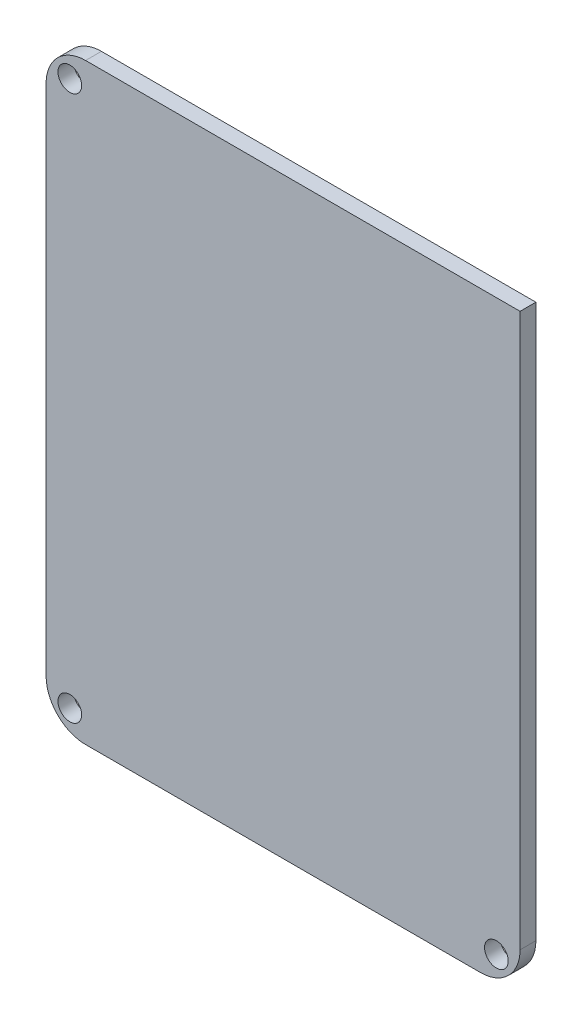
ISO-10303-21;
HEADER;
FILE_DESCRIPTION(('STEP AP214'),'2;1');
FILE_NAME('part.step','',(''),(''),'','','');
FILE_SCHEMA(('AUTOMOTIVE_DESIGN { 1 0 10303 214 1 1 1 1 }'));
ENDSEC;
DATA;
#1=APPLICATION_CONTEXT('core data for automotive mechanical design processes');
#2=APPLICATION_PROTOCOL_DEFINITION('international standard','automotive_design',2000,#1);
#3=PRODUCT_CONTEXT('',#1,'mechanical');
#4=PRODUCT('Part','Part','',(#3));
#5=PRODUCT_RELATED_PRODUCT_CATEGORY('part','',(#4));
#6=PRODUCT_DEFINITION_FORMATION('','',#4);
#7=PRODUCT_DEFINITION_CONTEXT('part definition',#1,'design');
#8=PRODUCT_DEFINITION('design','',#6,#7);
#9=PRODUCT_DEFINITION_SHAPE('','',#8);
#10=(LENGTH_UNIT() NAMED_UNIT(*) SI_UNIT(.MILLI.,.METRE.));
#11=(NAMED_UNIT(*) PLANE_ANGLE_UNIT() SI_UNIT($,.RADIAN.));
#12=(NAMED_UNIT(*) SI_UNIT($,.STERADIAN.) SOLID_ANGLE_UNIT());
#13=UNCERTAINTY_MEASURE_WITH_UNIT(LENGTH_MEASURE(1.E-05),#10,'distance_accuracy_value','');
#14=(GEOMETRIC_REPRESENTATION_CONTEXT(3) GLOBAL_UNCERTAINTY_ASSIGNED_CONTEXT((#13)) GLOBAL_UNIT_ASSIGNED_CONTEXT((#10,
#11,#12)) REPRESENTATION_CONTEXT('',''));
#15=CARTESIAN_POINT('',(0.,0.,0.));
#16=DIRECTION('',(0.,0.,1.));
#17=DIRECTION('',(1.,0.,0.));
#18=AXIS2_PLACEMENT_3D('',#15,#16,#17);
#19=CARTESIAN_POINT('',(-53.9067346155954,69.7984729756882,2.));
#20=DIRECTION('',(1.,0.,0.));
#21=DIRECTION('',(0.,0.,-1.));
#22=AXIS2_PLACEMENT_3D('',#19,#20,#21);
#23=PLANE('',#22);
#24=DIRECTION('',(0.,-1.,0.));
#25=VECTOR('',#24,1.);
#26=CARTESIAN_POINT('',(-53.9067346155954,69.7984729756882,0.));
#27=LINE('',#26,#25);
#28=CARTESIAN_POINT('',(-53.9067346155954,64.7984729756882,0.));
#29=VERTEX_POINT('',#28);
#30=CARTESIAN_POINT('',(-53.9067346155954,-0.201527024311823,0.));
#31=VERTEX_POINT('',#30);
#32=EDGE_CURVE('E129',#29,#31,#27,.T.);
#33=ORIENTED_EDGE('',*,*,#32,.T.);
#34=CARTESIAN_POINT('',(-53.9067346155954,-0.201527024311829,6.));
#35=CARTESIAN_POINT('',(-53.9067346155954,-0.201527024311829,4.66666666666667));
#36=CARTESIAN_POINT('',(-53.9067346155954,-0.201527024311829,3.33333333333333));
#37=CARTESIAN_POINT('',(-53.9067346155954,-0.201527024311829,2.));
#38=CARTESIAN_POINT('',(-53.9067346155954,-0.201527024311829,1.33333333333333));
#39=CARTESIAN_POINT('',(-53.9067346155954,-0.201527024311829,0.666666666666667));
#40=CARTESIAN_POINT('',(-53.9067346155954,-0.201527024311829,0.));
#41=CARTESIAN_POINT('',(-53.9067346155954,-0.201527024311829,-1.33333333333333));
#42=CARTESIAN_POINT('',(-53.9067346155954,-0.201527024311829,-2.66666666666667));
#43=CARTESIAN_POINT('',(-53.9067346155954,-0.201527024311829,-4.));
#44=(BOUNDED_CURVE() B_SPLINE_CURVE(3,(#34,#35,#36,#37,#38,#39,#40,#41,#42,#43),.UNSPECIFIED.,
.F.,.F.) B_SPLINE_CURVE_WITH_KNOTS((4,3,3,4),(-0.004,0.,0.002,0.006),
.UNSPECIFIED.) CURVE() GEOMETRIC_REPRESENTATION_ITEM() RATIONAL_B_SPLINE_CURVE((1.,1.,1.,1.,1.,
1.,1.,1.,1.,1.)) REPRESENTATION_ITEM(''));
#45=CARTESIAN_POINT('',(-53.9067346155954,-0.201527024311823,2.));
#46=VERTEX_POINT('',#45);
#47=EDGE_CURVE('E53',#31,#46,#44,.F.);
#48=ORIENTED_EDGE('',*,*,#47,.T.);
#49=DIRECTION('',(0.,-1.,0.));
#50=VECTOR('',#49,1.);
#51=CARTESIAN_POINT('',(-53.9067346155954,69.7984729756882,2.));
#52=LINE('',#51,#50);
#53=CARTESIAN_POINT('',(-53.9067346155954,64.7984729756882,2.));
#54=VERTEX_POINT('',#53);
#55=EDGE_CURVE('E137',#54,#46,#52,.T.);
#56=ORIENTED_EDGE('',*,*,#55,.F.);
#57=CARTESIAN_POINT('',(-53.9067346155954,64.7984729756882,6.));
#58=CARTESIAN_POINT('',(-53.9067346155954,64.7984729756882,4.66666666666667));
#59=CARTESIAN_POINT('',(-53.9067346155954,64.7984729756882,3.33333333333333));
#60=CARTESIAN_POINT('',(-53.9067346155954,64.7984729756882,2.));
#61=CARTESIAN_POINT('',(-53.9067346155954,64.7984729756882,1.33333333333333));
#62=CARTESIAN_POINT('',(-53.9067346155954,64.7984729756882,0.666666666666667));
#63=CARTESIAN_POINT('',(-53.9067346155954,64.7984729756882,0.));
#64=CARTESIAN_POINT('',(-53.9067346155954,64.7984729756882,-1.33333333333333));
#65=CARTESIAN_POINT('',(-53.9067346155954,64.7984729756882,-2.66666666666667));
#66=CARTESIAN_POINT('',(-53.9067346155954,64.7984729756882,-4.));
#67=(BOUNDED_CURVE() B_SPLINE_CURVE(3,(#57,#58,#59,#60,#61,#62,#63,#64,#65,#66),.UNSPECIFIED.,
.F.,.F.) B_SPLINE_CURVE_WITH_KNOTS((4,3,3,4),(-0.004,0.,0.002,0.006),
.UNSPECIFIED.) CURVE() GEOMETRIC_REPRESENTATION_ITEM() RATIONAL_B_SPLINE_CURVE((1.,1.,1.,1.,1.,
1.,1.,1.,1.,1.)) REPRESENTATION_ITEM(''));
#68=EDGE_CURVE('E211',#54,#29,#67,.T.);
#69=ORIENTED_EDGE('',*,*,#68,.T.);
#70=EDGE_LOOP('',(#33,#48,#56,#69));
#71=FACE_BOUND('',#70,.T.);
#72=ADVANCED_FACE('F39',(#71),#23,.F.);
#73=CARTESIAN_POINT('',(-53.9067346155954,-5.20152702431183,2.));
#74=DIRECTION('',(0.,1.,0.));
#75=DIRECTION('',(0.,0.,1.));
#76=AXIS2_PLACEMENT_3D('',#73,#74,#75);
#77=PLANE('',#76);
#78=DIRECTION('',(1.,0.,0.));
#79=VECTOR('',#78,1.);
#80=CARTESIAN_POINT('',(-53.9067346155954,-5.20152702431183,0.));
#81=LINE('',#80,#79);
#82=CARTESIAN_POINT('',(-48.9067346155954,-5.20152702431183,0.));
#83=VERTEX_POINT('',#82);
#84=CARTESIAN_POINT('',(1.0932653844046,-5.20152702431183,0.));
#85=VERTEX_POINT('',#84);
#86=EDGE_CURVE('E131',#83,#85,#81,.T.);
#87=ORIENTED_EDGE('',*,*,#86,.T.);
#88=CARTESIAN_POINT('',(1.0932653844046,-5.20152702431183,6.));
#89=CARTESIAN_POINT('',(1.0932653844046,-5.20152702431183,4.66666666666667));
#90=CARTESIAN_POINT('',(1.0932653844046,-5.20152702431183,3.33333333333333));
#91=CARTESIAN_POINT('',(1.0932653844046,-5.20152702431183,2.));
#92=CARTESIAN_POINT('',(1.0932653844046,-5.20152702431183,1.33333333333333));
#93=CARTESIAN_POINT('',(1.0932653844046,-5.20152702431183,0.666666666666667));
#94=CARTESIAN_POINT('',(1.0932653844046,-5.20152702431183,0.));
#95=CARTESIAN_POINT('',(1.0932653844046,-5.20152702431183,-1.33333333333333));
#96=CARTESIAN_POINT('',(1.0932653844046,-5.20152702431183,-2.66666666666667));
#97=CARTESIAN_POINT('',(1.0932653844046,-5.20152702431183,-4.));
#98=(BOUNDED_CURVE() B_SPLINE_CURVE(3,(#88,#89,#90,#91,#92,#93,#94,#95,#96,#97),.UNSPECIFIED.,
.F.,.F.) B_SPLINE_CURVE_WITH_KNOTS((4,3,3,4),(-0.004,0.,0.002,0.006),
.UNSPECIFIED.) CURVE() GEOMETRIC_REPRESENTATION_ITEM() RATIONAL_B_SPLINE_CURVE((1.,1.,1.,1.,1.,
1.,1.,1.,1.,1.)) REPRESENTATION_ITEM(''));
#99=CARTESIAN_POINT('',(1.0932653844046,-5.20152702431183,2.));
#100=VERTEX_POINT('',#99);
#101=EDGE_CURVE('E242',#85,#100,#98,.F.);
#102=ORIENTED_EDGE('',*,*,#101,.T.);
#103=DIRECTION('',(1.,0.,0.));
#104=VECTOR('',#103,1.);
#105=CARTESIAN_POINT('',(-53.9067346155954,-5.20152702431183,2.));
#106=LINE('',#105,#104);
#107=CARTESIAN_POINT('',(-48.9067346155954,-5.20152702431183,2.));
#108=VERTEX_POINT('',#107);
#109=EDGE_CURVE('E115',#108,#100,#106,.T.);
#110=ORIENTED_EDGE('',*,*,#109,.F.);
#111=CARTESIAN_POINT('',(-48.9067346155954,-5.20152702431183,6.));
#112=CARTESIAN_POINT('',(-48.9067346155954,-5.20152702431183,4.66666666666667));
#113=CARTESIAN_POINT('',(-48.9067346155954,-5.20152702431183,3.33333333333333));
#114=CARTESIAN_POINT('',(-48.9067346155954,-5.20152702431183,2.));
#115=CARTESIAN_POINT('',(-48.9067346155954,-5.20152702431183,1.33333333333333));
#116=CARTESIAN_POINT('',(-48.9067346155954,-5.20152702431183,0.666666666666667));
#117=CARTESIAN_POINT('',(-48.9067346155954,-5.20152702431183,0.));
#118=CARTESIAN_POINT('',(-48.9067346155954,-5.20152702431183,-1.33333333333333));
#119=CARTESIAN_POINT('',(-48.9067346155954,-5.20152702431183,-2.66666666666667));
#120=CARTESIAN_POINT('',(-48.9067346155954,-5.20152702431183,-4.));
#121=(BOUNDED_CURVE() B_SPLINE_CURVE(3,(#111,#112,#113,#114,#115,#116,#117,#118,#119,#120),
.UNSPECIFIED.,.F.,.F.) B_SPLINE_CURVE_WITH_KNOTS((4,3,3,4),(-0.004,0.,0.002,0.006),
.UNSPECIFIED.) CURVE() GEOMETRIC_REPRESENTATION_ITEM() RATIONAL_B_SPLINE_CURVE((1.,1.,1.,1.,1.,
1.,1.,1.,1.,1.)) REPRESENTATION_ITEM(''));
#122=EDGE_CURVE('E177',#108,#83,#121,.T.);
#123=ORIENTED_EDGE('',*,*,#122,.T.);
#124=EDGE_LOOP('',(#87,#102,#110,#123));
#125=FACE_BOUND('',#124,.T.);
#126=ADVANCED_FACE('F240',(#125),#77,.F.);
#127=CARTESIAN_POINT('',(6.0932653844046,69.7984729756882,2.));
#128=DIRECTION('',(-1.,0.,0.));
#129=DIRECTION('',(0.,-1.,0.));
#130=AXIS2_PLACEMENT_3D('',#127,#128,#129);
#131=PLANE('',#130);
#132=DIRECTION('',(0.,1.,0.));
#133=VECTOR('',#132,1.);
#134=CARTESIAN_POINT('',(6.0932653844046,69.7984729756882,2.));
#135=LINE('',#134,#133);
#136=CARTESIAN_POINT('',(6.0932653844046,-0.201527024311823,2.));
#137=VERTEX_POINT('',#136);
#138=CARTESIAN_POINT('',(6.0932653844046,69.7984729756882,2.));
#139=VERTEX_POINT('',#138);
#140=EDGE_CURVE('E104',#137,#139,#135,.T.);
#141=ORIENTED_EDGE('',*,*,#140,.F.);
#142=CARTESIAN_POINT('',(6.0932653844046,-0.201527024311827,6.));
#143=CARTESIAN_POINT('',(6.0932653844046,-0.201527024311827,4.66666666666667));
#144=CARTESIAN_POINT('',(6.0932653844046,-0.201527024311827,3.33333333333333));
#145=CARTESIAN_POINT('',(6.0932653844046,-0.201527024311827,2.));
#146=CARTESIAN_POINT('',(6.0932653844046,-0.201527024311827,1.33333333333333));
#147=CARTESIAN_POINT('',(6.0932653844046,-0.201527024311827,0.666666666666667));
#148=CARTESIAN_POINT('',(6.0932653844046,-0.201527024311827,0.));
#149=CARTESIAN_POINT('',(6.0932653844046,-0.201527024311827,-1.33333333333333));
#150=CARTESIAN_POINT('',(6.0932653844046,-0.201527024311827,-2.66666666666667));
#151=CARTESIAN_POINT('',(6.0932653844046,-0.201527024311827,-4.));
#152=(BOUNDED_CURVE() B_SPLINE_CURVE(3,(#142,#143,#144,#145,#146,#147,#148,#149,#150,#151),
.UNSPECIFIED.,.F.,.F.) B_SPLINE_CURVE_WITH_KNOTS((4,3,3,4),(-0.004,0.,0.002,0.006),
.UNSPECIFIED.) CURVE() GEOMETRIC_REPRESENTATION_ITEM() RATIONAL_B_SPLINE_CURVE((1.,1.,1.,1.,1.,
1.,1.,1.,1.,1.)) REPRESENTATION_ITEM(''));
#153=CARTESIAN_POINT('',(6.0932653844046,-0.201527024311823,0.));
#154=VERTEX_POINT('',#153);
#155=EDGE_CURVE('E123',#137,#154,#152,.T.);
#156=ORIENTED_EDGE('',*,*,#155,.T.);
#157=DIRECTION('',(0.,1.,0.));
#158=VECTOR('',#157,1.);
#159=CARTESIAN_POINT('',(6.0932653844046,69.7984729756882,0.));
#160=LINE('',#159,#158);
#161=CARTESIAN_POINT('',(6.0932653844046,69.7984729756882,0.));
#162=VERTEX_POINT('',#161);
#163=EDGE_CURVE('E121',#154,#162,#160,.T.);
#164=ORIENTED_EDGE('',*,*,#163,.T.);
#165=DIRECTION('',(0.,0.,-1.));
#166=VECTOR('',#165,1.);
#167=CARTESIAN_POINT('',(6.0932653844046,69.7984729756882,2.));
#168=LINE('',#167,#166);
#169=EDGE_CURVE('E118',#139,#162,#168,.T.);
#170=ORIENTED_EDGE('',*,*,#169,.F.);
#171=EDGE_LOOP('',(#141,#156,#164,#170));
#172=FACE_BOUND('',#171,.T.);
#173=ADVANCED_FACE('F119',(#172),#131,.F.);
#174=CARTESIAN_POINT('',(-53.9067346155954,69.7984729756882,2.));
#175=DIRECTION('',(0.,-1.,0.));
#176=DIRECTION('',(0.,0.,-1.));
#177=AXIS2_PLACEMENT_3D('',#174,#175,#176);
#178=PLANE('',#177);
#179=DIRECTION('',(-1.,0.,0.));
#180=VECTOR('',#179,1.);
#181=CARTESIAN_POINT('',(-53.9067346155954,69.7984729756882,0.));
#182=LINE('',#181,#180);
#183=CARTESIAN_POINT('',(-48.9067346155954,69.7984729756882,0.));
#184=VERTEX_POINT('',#183);
#185=EDGE_CURVE('E136',#162,#184,#182,.T.);
#186=ORIENTED_EDGE('',*,*,#185,.T.);
#187=CARTESIAN_POINT('',(-48.9067346155954,69.7984729756882,6.));
#188=CARTESIAN_POINT('',(-48.9067346155954,69.7984729756882,4.66666666666667));
#189=CARTESIAN_POINT('',(-48.9067346155954,69.7984729756882,3.33333333333333));
#190=CARTESIAN_POINT('',(-48.9067346155954,69.7984729756882,2.));
#191=CARTESIAN_POINT('',(-48.9067346155954,69.7984729756882,1.33333333333333));
#192=CARTESIAN_POINT('',(-48.9067346155954,69.7984729756882,0.666666666666667));
#193=CARTESIAN_POINT('',(-48.9067346155954,69.7984729756882,0.));
#194=CARTESIAN_POINT('',(-48.9067346155954,69.7984729756882,-1.33333333333333));
#195=CARTESIAN_POINT('',(-48.9067346155954,69.7984729756882,-2.66666666666667));
#196=CARTESIAN_POINT('',(-48.9067346155954,69.7984729756882,-4.));
#197=(BOUNDED_CURVE() B_SPLINE_CURVE(3,(#187,#188,#189,#190,#191,#192,#193,#194,#195,#196),
.UNSPECIFIED.,.F.,.F.) B_SPLINE_CURVE_WITH_KNOTS((4,3,3,4),(-0.004,0.,0.002,0.006),
.UNSPECIFIED.) CURVE() GEOMETRIC_REPRESENTATION_ITEM() RATIONAL_B_SPLINE_CURVE((1.,1.,1.,1.,1.,
1.,1.,1.,1.,1.)) REPRESENTATION_ITEM(''));
#198=CARTESIAN_POINT('',(-48.9067346155954,69.7984729756882,2.));
#199=VERTEX_POINT('',#198);
#200=EDGE_CURVE('E12',#184,#199,#197,.F.);
#201=ORIENTED_EDGE('',*,*,#200,.T.);
#202=DIRECTION('',(-1.,0.,0.));
#203=VECTOR('',#202,1.);
#204=CARTESIAN_POINT('',(-53.9067346155954,69.7984729756882,2.));
#205=LINE('',#204,#203);
#206=EDGE_CURVE('E108',#139,#199,#205,.T.);
#207=ORIENTED_EDGE('',*,*,#206,.F.);
#208=ORIENTED_EDGE('',*,*,#169,.T.);
#209=EDGE_LOOP('',(#186,#201,#207,#208));
#210=FACE_BOUND('',#209,.T.);
#211=ADVANCED_FACE('F125',(#210),#178,.F.);
#212=CARTESIAN_POINT('',(0.,0.,2.));
#213=DIRECTION('',(0.,0.,1.));
#214=DIRECTION('',(1.,0.,0.));
#215=AXIS2_PLACEMENT_3D('',#212,#213,#214);
#216=PLANE('',#215);
#217=CARTESIAN_POINT('',(-50.9067346155954,66.7984729756882,2.));
#218=DIRECTION('',(0.,0.,1.));
#219=DIRECTION('',(1.,0.,0.));
#220=AXIS2_PLACEMENT_3D('',#217,#218,#219);
#221=CIRCLE('',#220,1.5);
#222=CARTESIAN_POINT('',(-49.4067346155954,66.7984729756882,2.));
#223=VERTEX_POINT('',#222);
#224=EDGE_CURVE('E267',#223,#223,#221,.T.);
#225=ORIENTED_EDGE('',*,*,#224,.F.);
#226=EDGE_LOOP('',(#225));
#227=FACE_BOUND('',#226,.T.);
#228=CARTESIAN_POINT('',(3.09326538440461,-2.20152702431183,2.));
#229=DIRECTION('',(0.,0.,1.));
#230=DIRECTION('',(1.,0.,0.));
#231=AXIS2_PLACEMENT_3D('',#228,#229,#230);
#232=CIRCLE('',#231,1.5);
#233=CARTESIAN_POINT('',(4.59326538440461,-2.20152702431183,2.));
#234=VERTEX_POINT('',#233);
#235=EDGE_CURVE('E261',#234,#234,#232,.T.);
#236=ORIENTED_EDGE('',*,*,#235,.F.);
#237=EDGE_LOOP('',(#236));
#238=FACE_BOUND('',#237,.T.);
#239=CARTESIAN_POINT('',(-50.9067346155954,-2.20152702431183,2.));
#240=DIRECTION('',(0.,0.,1.));
#241=DIRECTION('',(1.,0.,0.));
#242=AXIS2_PLACEMENT_3D('',#239,#240,#241);
#243=CIRCLE('',#242,1.5);
#244=CARTESIAN_POINT('',(-49.4067346155954,-2.20152702431183,2.));
#245=VERTEX_POINT('',#244);
#246=EDGE_CURVE('E255',#245,#245,#243,.T.);
#247=ORIENTED_EDGE('',*,*,#246,.F.);
#248=EDGE_LOOP('',(#247));
#249=FACE_BOUND('',#248,.T.);
#250=ORIENTED_EDGE('',*,*,#109,.T.);
#251=CARTESIAN_POINT('',(1.0932653844046,-5.20152702431183,2.));
#252=CARTESIAN_POINT('',(1.23389567922772,-5.2015421466558,2.));
#253=CARTESIAN_POINT('',(1.37452380353334,-5.19559459515653,2.));
#254=CARTESIAN_POINT('',(1.6547738908614,-5.17188336622226,2.));
#255=CARTESIAN_POINT('',(1.79439590182419,-5.15412025560138,2.));
#256=CARTESIAN_POINT('',(2.07154087736499,-5.10690495585043,2.));
#257=CARTESIAN_POINT('',(2.20906534830119,-5.07746160933643,2.));
#258=CARTESIAN_POINT('',(2.48114490326872,-5.00710002063408,2.));
#259=CARTESIAN_POINT('',(2.61570002352584,-4.96618191852025,2.));
#260=CARTESIAN_POINT('',(2.88092678031722,-4.87314598375576,2.));
#261=CARTESIAN_POINT('',(3.0115972293086,-4.8210247655881,2.));
#262=CARTESIAN_POINT('',(3.26813080676646,-4.7059394170615,2.));
#263=CARTESIAN_POINT('',(3.39399214041668,-4.64297128588459,2.));
#264=CARTESIAN_POINT('',(3.63989399894763,-4.50669044328173,2.));
#265=CARTESIAN_POINT('',(3.75993765973417,-4.43338339009385,2.));
#266=CARTESIAN_POINT('',(3.99346769345669,-4.27689085330054,2.));
#267=CARTESIAN_POINT('',(4.10695163493643,-4.1937017412299,2.));
#268=CARTESIAN_POINT('',(4.32646553685194,-4.01809165962601,2.));
#269=CARTESIAN_POINT('',(4.43249831382802,-3.92567421073416,2.));
#270=CARTESIAN_POINT('',(4.63644195349461,-3.73220164807186,2.));
#271=CARTESIAN_POINT('',(4.73434977587649,-3.63114332940368,2.));
#272=CARTESIAN_POINT('',(4.92128744986757,-3.42115494210269,2.));
#273=CARTESIAN_POINT('',(5.01031879048617,-3.31222619902073,2.));
#274=CARTESIAN_POINT('',(5.17891936735852,-3.0872163000013,2.));
#275=CARTESIAN_POINT('',(5.25848522746781,-2.97113261431968,2.));
#276=CARTESIAN_POINT('',(5.40755331897001,-2.73267117836143,2.));
#277=CARTESIAN_POINT('',(5.47705538883348,-2.61029332710264,2.));
#278=CARTESIAN_POINT('',(5.60550012374205,-2.36011704201003,2.));
#279=CARTESIAN_POINT('',(5.66444274368383,-2.23231858502567,2.));
#280=CARTESIAN_POINT('',(5.77132372159595,-1.97226660778079,2.));
#281=CARTESIAN_POINT('',(5.81926735855736,-1.84001525979685,2.));
#282=CARTESIAN_POINT('',(5.90383472227703,-1.57199335910877,2.));
#283=CARTESIAN_POINT('',(5.94046091397629,-1.43622357971146,2.));
#284=CARTESIAN_POINT('',(6.01181664546114,-1.11906381565993,2.));
#285=CARTESIAN_POINT('',(6.04235891209967,-0.936704487992194,2.));
#286=CARTESIAN_POINT('',(6.07289919849986,-0.661701478659334,2.));
#287=CARTESIAN_POINT('',(6.08053376828899,-0.569836516089367,2.));
#288=CARTESIAN_POINT('',(6.09071624828025,-0.385830909417624,2.));
#289=CARTESIAN_POINT('',(6.09326448038056,-0.293690283131373,2.));
#290=CARTESIAN_POINT('',(6.0932653844046,-0.201527024311827,2.));
#291=B_SPLINE_CURVE_WITH_KNOTS('',3,(#251,#252,#253,#254,#255,#256,#257,#258,#259,#260,#261,
#262,#263,#264,#265,#266,#267,#268,#269,#270,#271,#272,#273,#274,#275,#276,#277,#278,#279,#280,
#281,#282,#283,#284,#285,#286,#287,#288,#289,#290),.UNSPECIFIED.,.F.,.F.,(4,2,2,2,2,2,2,2,2,2,2,
2,2,2,2,2,2,2,2,4),(0.,0.421762112767109,0.843503994288121,1.26492720019775,1.68634526193831,
2.10789085327979,2.52959226338523,2.95106377581048,3.37269052404618,3.79415703039214,
4.2157805424089,4.63733320863161,5.05903578615264,5.48074513148484,5.90245627805085,
6.32396459780776,6.74538104818462,7.29879231271561,7.57521919595989,7.85162858446835),.UNSPECIFIED.);
#292=EDGE_CURVE('E111',#100,#137,#291,.T.);
#293=ORIENTED_EDGE('',*,*,#292,.T.);
#294=ORIENTED_EDGE('',*,*,#140,.T.);
#295=ORIENTED_EDGE('',*,*,#206,.T.);
#296=CARTESIAN_POINT('',(-48.9067346155954,69.7984729756882,2.));
#297=CARTESIAN_POINT('',(-49.0473649104185,69.7984880980321,2.));
#298=CARTESIAN_POINT('',(-49.1879930347241,69.7925405465329,2.));
#299=CARTESIAN_POINT('',(-49.4682431220522,69.7688293175986,2.));
#300=CARTESIAN_POINT('',(-49.607865133015,69.7510662069777,2.));
#301=CARTESIAN_POINT('',(-49.8850101085558,69.7038509072268,2.));
#302=CARTESIAN_POINT('',(-50.022534579492,69.6744075607128,2.));
#303=CARTESIAN_POINT('',(-50.2946141344595,69.6040459720104,2.));
#304=CARTESIAN_POINT('',(-50.4291692547166,69.5631278698966,2.));
#305=CARTESIAN_POINT('',(-50.694396011508,69.4700919351321,2.));
#306=CARTESIAN_POINT('',(-50.8250664604994,69.4179707169644,2.));
#307=CARTESIAN_POINT('',(-51.0816000379572,69.3028853684378,2.));
#308=CARTESIAN_POINT('',(-51.2074613716075,69.239917237261,2.));
#309=CARTESIAN_POINT('',(-51.4533632301384,69.1036363946581,2.));
#310=CARTESIAN_POINT('',(-51.5734068909249,69.0303293414702,2.));
#311=CARTESIAN_POINT('',(-51.8069369246475,68.8738368046769,2.));
#312=CARTESIAN_POINT('',(-51.9204208661272,68.7906476926063,2.));
#313=CARTESIAN_POINT('',(-52.1399347680427,68.6150376110024,2.));
#314=CARTESIAN_POINT('',(-52.2459675450188,68.5226201621105,2.));
#315=CARTESIAN_POINT('',(-52.4499111846854,68.3291475994482,2.));
#316=CARTESIAN_POINT('',(-52.5478190070673,68.2280892807801,2.));
#317=CARTESIAN_POINT('',(-52.7347566810583,68.0181008934791,2.));
#318=CARTESIAN_POINT('',(-52.8237880216769,67.9091721503971,2.));
#319=CARTESIAN_POINT('',(-52.9923885985493,67.6841622513777,2.));
#320=CARTESIAN_POINT('',(-53.0719544586586,67.5680785656961,2.));
#321=CARTESIAN_POINT('',(-53.2210225501608,67.3296171297378,2.));
#322=CARTESIAN_POINT('',(-53.2905246200243,67.207239278479,2.));
#323=CARTESIAN_POINT('',(-53.4189693549328,66.9570629933864,2.));
#324=CARTESIAN_POINT('',(-53.4779119748746,66.8292645364021,2.));
#325=CARTESIAN_POINT('',(-53.5847929527867,66.5692125591572,2.));
#326=CARTESIAN_POINT('',(-53.6327365897481,66.4369612111732,2.));
#327=CARTESIAN_POINT('',(-53.7173039534678,66.1689393104851,2.));
#328=CARTESIAN_POINT('',(-53.7539301451671,66.0331695310879,2.));
#329=CARTESIAN_POINT('',(-53.8252858766519,65.7160097670363,2.));
#330=CARTESIAN_POINT('',(-53.8558281432905,65.5336504393686,2.));
#331=CARTESIAN_POINT('',(-53.8863684296906,65.2586474300357,2.));
#332=CARTESIAN_POINT('',(-53.8940029994798,65.1667824674657,2.));
#333=CARTESIAN_POINT('',(-53.904185479471,64.982776860794,2.));
#334=CARTESIAN_POINT('',(-53.9067337115714,64.8906362345077,2.));
#335=CARTESIAN_POINT('',(-53.9067346155954,64.7984729756882,2.));
#336=B_SPLINE_CURVE_WITH_KNOTS('',3,(#296,#297,#298,#299,#300,#301,#302,#303,#304,#305,#306,
#307,#308,#309,#310,#311,#312,#313,#314,#315,#316,#317,#318,#319,#320,#321,#322,#323,#324,#325,
#326,#327,#328,#329,#330,#331,#332,#333,#334,#335),.UNSPECIFIED.,.F.,.F.,(4,2,2,2,2,2,2,2,2,2,2,
2,2,2,2,2,2,2,2,4),(0.,0.4217621127671,0.843503994288108,1.26492720019772,1.68634526193828,
2.10789085327976,2.5295922633852,2.95106377581044,3.37269052404615,3.79415703039211,
4.21578054240886,4.63733320863157,5.0590357861526,5.48074513148481,5.90245627805082,
6.32396459780772,6.74538104818458,7.2987923127156,7.57521919595987,7.85162858446835),.UNSPECIFIED.);
#337=EDGE_CURVE('E243',#199,#54,#336,.T.);
#338=ORIENTED_EDGE('',*,*,#337,.T.);
#339=ORIENTED_EDGE('',*,*,#55,.T.);
#340=CARTESIAN_POINT('',(-53.9067346155954,-0.201527024311829,2.));
#341=CARTESIAN_POINT('',(-53.9067497379394,-0.342157319134948,2.));
#342=CARTESIAN_POINT('',(-53.9008021864401,-0.482785443440568,2.));
#343=CARTESIAN_POINT('',(-53.8770909575058,-0.763035530768629,2.));
#344=CARTESIAN_POINT('',(-53.859327846885,-0.902657541731418,2.));
#345=CARTESIAN_POINT('',(-53.812112547134,-1.17980251727222,2.));
#346=CARTESIAN_POINT('',(-53.78266920062,-1.31732698820842,2.));
#347=CARTESIAN_POINT('',(-53.7123076119176,-1.58940654317594,2.));
#348=CARTESIAN_POINT('',(-53.6713895098038,-1.72396166343306,2.));
#349=CARTESIAN_POINT('',(-53.5783535750393,-1.98918842022444,2.));
#350=CARTESIAN_POINT('',(-53.5262323568717,-2.11985886921583,2.));
#351=CARTESIAN_POINT('',(-53.4111470083451,-2.37639244667369,2.));
#352=CARTESIAN_POINT('',(-53.3481788771681,-2.50225378032391,2.));
#353=CARTESIAN_POINT('',(-53.2118980345653,-2.74815563885486,2.));
#354=CARTESIAN_POINT('',(-53.1385909813774,-2.8681992996414,2.));
#355=CARTESIAN_POINT('',(-52.9820984445841,-3.10172933336393,2.));
#356=CARTESIAN_POINT('',(-52.8989093325135,-3.21521327484367,2.));
#357=CARTESIAN_POINT('',(-52.7232992509096,-3.43472717675917,2.));
#358=CARTESIAN_POINT('',(-52.6308818020177,-3.54075995373525,2.));
#359=CARTESIAN_POINT('',(-52.4374092393554,-3.74470359340184,2.));
#360=CARTESIAN_POINT('',(-52.3363509206872,-3.84261141578372,2.));
#361=CARTESIAN_POINT('',(-52.1263625333862,-4.0295490897748,2.));
#362=CARTESIAN_POINT('',(-52.0174337903043,-4.11858043039339,2.));
#363=CARTESIAN_POINT('',(-51.7924238912848,-4.28718100726574,2.));
#364=CARTESIAN_POINT('',(-51.6763402056032,-4.36674686737503,2.));
#365=CARTESIAN_POINT('',(-51.437878769645,-4.51581495887724,2.));
#366=CARTESIAN_POINT('',(-51.3155009183862,-4.58531702874071,2.));
#367=CARTESIAN_POINT('',(-51.0653246332936,-4.71376176364928,2.));
#368=CARTESIAN_POINT('',(-50.9375261763092,-4.77270438359106,2.));
#369=CARTESIAN_POINT('',(-50.6774741990643,-4.87958536150318,2.));
#370=CARTESIAN_POINT('',(-50.5452228510804,-4.92752899846459,2.));
#371=CARTESIAN_POINT('',(-50.2772009503923,-5.01209636218425,2.));
#372=CARTESIAN_POINT('',(-50.141431170995,-5.04872255388352,2.));
#373=CARTESIAN_POINT('',(-49.8242714069435,-5.12007828536836,2.));
#374=CARTESIAN_POINT('',(-49.6419120792758,-5.1506205520069,2.));
#375=CARTESIAN_POINT('',(-49.3669090699429,-5.18116083840708,2.));
#376=CARTESIAN_POINT('',(-49.2750441073729,-5.18879540819621,2.));
#377=CARTESIAN_POINT('',(-49.0910385007012,-5.19897788818747,2.));
#378=CARTESIAN_POINT('',(-48.9988978744149,-5.20152612028778,2.));
#379=CARTESIAN_POINT('',(-48.9067346155954,-5.20152702431183,2.));
#380=B_SPLINE_CURVE_WITH_KNOTS('',3,(#340,#341,#342,#343,#344,#345,#346,#347,#348,#349,#350,
#351,#352,#353,#354,#355,#356,#357,#358,#359,#360,#361,#362,#363,#364,#365,#366,#367,#368,#369,
#370,#371,#372,#373,#374,#375,#376,#377,#378,#379),.UNSPECIFIED.,.F.,.F.,(4,2,2,2,2,2,2,2,2,2,2,
2,2,2,2,2,2,2,2,4),(0.,0.421762112767111,0.843503994288122,1.26492720019775,1.68634526193831,
2.1078908532798,2.52959226338524,2.95106377581049,3.37269052404619,3.79415703039216,
4.21578054240891,4.63733320863163,5.05903578615265,5.48074513148485,5.90245627805086,
6.32396459780776,6.74538104818462,7.29879231271561,7.57521919595989,7.85162858446835),.UNSPECIFIED.);
#381=EDGE_CURVE('E212',#46,#108,#380,.T.);
#382=ORIENTED_EDGE('',*,*,#381,.T.);
#383=EDGE_LOOP('',(#250,#293,#294,#295,#338,#339,#382));
#384=FACE_BOUND('',#383,.T.);
#385=ADVANCED_FACE('F107',(#227,#238,#249,#384),#216,.T.);
#386=CARTESIAN_POINT('',(0.,0.,0.));
#387=DIRECTION('',(0.,0.,1.));
#388=DIRECTION('',(1.,0.,0.));
#389=AXIS2_PLACEMENT_3D('',#386,#387,#388);
#390=PLANE('',#389);
#391=CARTESIAN_POINT('',(-50.9067346155954,66.7984729756882,0.));
#392=DIRECTION('',(0.,0.,1.));
#393=DIRECTION('',(1.,0.,0.));
#394=AXIS2_PLACEMENT_3D('',#391,#392,#393);
#395=CIRCLE('',#394,1.5);
#396=CARTESIAN_POINT('',(-49.4067346155954,66.7984729756882,0.));
#397=VERTEX_POINT('',#396);
#398=EDGE_CURVE('E132',#397,#397,#395,.T.);
#399=ORIENTED_EDGE('',*,*,#398,.T.);
#400=EDGE_LOOP('',(#399));
#401=FACE_BOUND('',#400,.T.);
#402=CARTESIAN_POINT('',(3.09326538440461,-2.20152702431183,0.));
#403=DIRECTION('',(0.,0.,1.));
#404=DIRECTION('',(1.,0.,0.));
#405=AXIS2_PLACEMENT_3D('',#402,#403,#404);
#406=CIRCLE('',#405,1.5);
#407=CARTESIAN_POINT('',(4.59326538440461,-2.20152702431183,0.));
#408=VERTEX_POINT('',#407);
#409=EDGE_CURVE('E264',#408,#408,#406,.T.);
#410=ORIENTED_EDGE('',*,*,#409,.T.);
#411=EDGE_LOOP('',(#410));
#412=FACE_BOUND('',#411,.T.);
#413=CARTESIAN_POINT('',(-50.9067346155954,-2.20152702431183,0.));
#414=DIRECTION('',(0.,0.,1.));
#415=DIRECTION('',(1.,0.,0.));
#416=AXIS2_PLACEMENT_3D('',#413,#414,#415);
#417=CIRCLE('',#416,1.5);
#418=CARTESIAN_POINT('',(-49.4067346155954,-2.20152702431183,0.));
#419=VERTEX_POINT('',#418);
#420=EDGE_CURVE('E258',#419,#419,#417,.T.);
#421=ORIENTED_EDGE('',*,*,#420,.T.);
#422=EDGE_LOOP('',(#421));
#423=FACE_BOUND('',#422,.T.);
#424=ORIENTED_EDGE('',*,*,#163,.F.);
#425=CARTESIAN_POINT('',(6.0932653844046,-0.201527024311827,0.));
#426=CARTESIAN_POINT('',(6.09328050674858,-0.342157319134964,0.));
#427=CARTESIAN_POINT('',(6.0873329552493,-0.4827854434406,0.));
#428=CARTESIAN_POINT('',(6.06362172631503,-0.763035530768696,0.));
#429=CARTESIAN_POINT('',(6.04585861569415,-0.902657541731503,0.));
#430=CARTESIAN_POINT('',(5.99864331594318,-1.17980251727233,0.));
#431=CARTESIAN_POINT('',(5.96919996942917,-1.31732698820855,0.));
#432=CARTESIAN_POINT('',(5.89883838072681,-1.58940654317611,0.));
#433=CARTESIAN_POINT('',(5.85792027861297,-1.72396166343324,0.));
#434=CARTESIAN_POINT('',(5.76488434384845,-1.98918842022465,0.));
#435=CARTESIAN_POINT('',(5.71276312568078,-2.11985886921605,0.));
#436=CARTESIAN_POINT('',(5.59767777715416,-2.37639244667394,0.));
#437=CARTESIAN_POINT('',(5.53470964597722,-2.50225378032418,0.));
#438=CARTESIAN_POINT('',(5.39842880337434,-2.74815563885515,0.));
#439=CARTESIAN_POINT('',(5.32512175018643,-2.8681992996417,0.));
#440=CARTESIAN_POINT('',(5.16862921339309,-3.10172933336424,0.));
#441=CARTESIAN_POINT('',(5.08544010132242,-3.21521327484399,0.));
#442=CARTESIAN_POINT('',(4.9098300197185,-3.4347271767595,0.));
#443=CARTESIAN_POINT('',(4.81741257082664,-3.54075995373557,0.));
#444=CARTESIAN_POINT('',(4.62394000816432,-3.74470359340214,0.));
#445=CARTESIAN_POINT('',(4.52288168949614,-3.84261141578401,0.));
#446=CARTESIAN_POINT('',(4.31289330219513,-4.02954908977508,0.));
#447=CARTESIAN_POINT('',(4.20396455911316,-4.11858043039366,0.));
#448=CARTESIAN_POINT('',(3.97895466009372,-4.28718100726599,0.));
#449=CARTESIAN_POINT('',(3.86287097441209,-4.36674686737528,0.));
#450=CARTESIAN_POINT('',(3.62440953845382,-4.51581495887746,0.));
#451=CARTESIAN_POINT('',(3.50203168719504,-4.58531702874092,0.));
#452=CARTESIAN_POINT('',(3.25185540210241,-4.71376176364947,0.));
#453=CARTESIAN_POINT('',(3.12405694511804,-4.77270438359124,0.));
#454=CARTESIAN_POINT('',(2.86400496787315,-4.87958536150333,0.));
#455=CARTESIAN_POINT('',(2.73175361988921,-4.92752899846473,0.));
#456=CARTESIAN_POINT('',(2.46373171920112,-5.01209636218437,0.));
#457=CARTESIAN_POINT('',(2.32796193980381,-5.04872255388362,0.));
#458=CARTESIAN_POINT('',(2.01080217575235,-5.12007828536843,0.));
#459=CARTESIAN_POINT('',(1.82844284808468,-5.15062055200694,0.));
#460=CARTESIAN_POINT('',(1.55343983875193,-5.18116083840709,0.));
#461=CARTESIAN_POINT('',(1.461574876182,-5.18879540819622,0.));
#462=CARTESIAN_POINT('',(1.27756926951033,-5.19897788818747,0.));
#463=CARTESIAN_POINT('',(1.18542864322411,-5.20152612028778,0.));
#464=CARTESIAN_POINT('',(1.0932653844046,-5.20152702431183,0.));
#465=B_SPLINE_CURVE_WITH_KNOTS('',3,(#425,#426,#427,#428,#429,#430,#431,#432,#433,#434,#435,
#436,#437,#438,#439,#440,#441,#442,#443,#444,#445,#446,#447,#448,#449,#450,#451,#452,#453,#454,
#455,#456,#457,#458,#459,#460,#461,#462,#463,#464),.UNSPECIFIED.,.F.,.F.,(4,2,2,2,2,2,2,2,2,2,2,
2,2,2,2,2,2,2,2,4),(0.,0.421762112767162,0.843503994288227,1.2649272001979,1.68634526193852,
2.10789085328006,2.52959226338556,2.95106377581086,3.37269052404662,3.79415703039258,
4.21578054240934,4.63733320863205,5.05903578615308,5.48074513148528,5.90245627805129,
6.3239645978082,6.74538104818506,7.29879231271583,7.57521919596,7.85162858446835),.UNSPECIFIED.);
#466=EDGE_CURVE('E170',#154,#85,#465,.T.);
#467=ORIENTED_EDGE('',*,*,#466,.T.);
#468=ORIENTED_EDGE('',*,*,#86,.F.);
#469=CARTESIAN_POINT('',(-48.9067346155954,-5.20152702431183,0.));
#470=CARTESIAN_POINT('',(-49.0473649104185,-5.2015421466558,0.));
#471=CARTESIAN_POINT('',(-49.1879930347242,-5.19559459515652,0.));
#472=CARTESIAN_POINT('',(-49.4682431220523,-5.17188336622225,0.));
#473=CARTESIAN_POINT('',(-49.6078651330151,-5.15412025560137,0.));
#474=CARTESIAN_POINT('',(-49.8850101085559,-5.1069049558504,0.));
#475=CARTESIAN_POINT('',(-50.0225345794921,-5.0774616093364,0.));
#476=CARTESIAN_POINT('',(-50.2946141344597,-5.00710002063403,0.));
#477=CARTESIAN_POINT('',(-50.4291692547168,-4.96618191852019,0.));
#478=CARTESIAN_POINT('',(-50.6943960115082,-4.87314598375567,0.));
#479=CARTESIAN_POINT('',(-50.8250664604996,-4.82102476558801,0.));
#480=CARTESIAN_POINT('',(-51.0816000379575,-4.70593941706138,0.));
#481=CARTESIAN_POINT('',(-51.2074613716077,-4.64297128588444,0.));
#482=CARTESIAN_POINT('',(-51.4533632301387,-4.50669044328156,0.));
#483=CARTESIAN_POINT('',(-51.5734068909253,-4.43338339009365,0.));
#484=CARTESIAN_POINT('',(-51.8069369246478,-4.27689085330031,0.));
#485=CARTESIAN_POINT('',(-51.9204208661276,-4.19370174122964,0.));
#486=CARTESIAN_POINT('',(-52.1399347680431,-4.01809165962573,0.));
#487=CARTESIAN_POINT('',(-52.2459675450191,-3.92567421073387,0.));
#488=CARTESIAN_POINT('',(-52.4499111846857,-3.73220164807154,0.));
#489=CARTESIAN_POINT('',(-52.5478190070676,-3.63114332940335,0.));
#490=CARTESIAN_POINT('',(-52.7347566810586,-3.42115494210234,0.));
#491=CARTESIAN_POINT('',(-52.8237880216772,-3.31222619902037,0.));
#492=CARTESIAN_POINT('',(-52.9923885985496,-3.08721630000093,0.));
#493=CARTESIAN_POINT('',(-53.0719544586588,-2.9711326143193,0.));
#494=CARTESIAN_POINT('',(-53.221022550161,-2.73267117836104,0.));
#495=CARTESIAN_POINT('',(-53.2905246200245,-2.61029332710225,0.));
#496=CARTESIAN_POINT('',(-53.418969354933,-2.36011704200962,0.));
#497=CARTESIAN_POINT('',(-53.4779119748748,-2.23231858502526,0.));
#498=CARTESIAN_POINT('',(-53.5847929527869,-1.97226660778037,0.));
#499=CARTESIAN_POINT('',(-53.6327365897483,-1.84001525979643,0.));
#500=CARTESIAN_POINT('',(-53.7173039534679,-1.57199335910834,0.));
#501=CARTESIAN_POINT('',(-53.7539301451672,-1.43622357971103,0.));
#502=CARTESIAN_POINT('',(-53.825285876652,-1.11906381565957,0.));
#503=CARTESIAN_POINT('',(-53.8558281432905,-0.936704487991903,0.));
#504=CARTESIAN_POINT('',(-53.8863684296907,-0.661701478659152,0.));
#505=CARTESIAN_POINT('',(-53.8940029994798,-0.569836516089222,0.));
#506=CARTESIAN_POINT('',(-53.904185479471,-0.385830909417552,0.));
#507=CARTESIAN_POINT('',(-53.9067337115713,-0.293690283131338,0.));
#508=CARTESIAN_POINT('',(-53.9067346155954,-0.201527024311829,0.));
#509=B_SPLINE_CURVE_WITH_KNOTS('',3,(#469,#470,#471,#472,#473,#474,#475,#476,#477,#478,#479,
#480,#481,#482,#483,#484,#485,#486,#487,#488,#489,#490,#491,#492,#493,#494,#495,#496,#497,#498,
#499,#500,#501,#502,#503,#504,#505,#506,#507,#508),.UNSPECIFIED.,.F.,.F.,(4,2,2,2,2,2,2,2,2,2,2,
2,2,2,2,2,2,2,2,4),(0.,0.421762112767163,0.843503994288227,1.2649272001979,1.68634526193852,
2.10789085328006,2.52959226338556,2.95106377581086,3.37269052404662,3.79415703039258,
4.21578054240935,4.63733320863206,5.05903578615309,5.48074513148529,5.9024562780513,
6.3239645978082,6.74538104818506,7.29879231271583,7.57521919596,7.85162858446835),.UNSPECIFIED.);
#510=EDGE_CURVE('E152',#83,#31,#509,.T.);
#511=ORIENTED_EDGE('',*,*,#510,.T.);
#512=ORIENTED_EDGE('',*,*,#32,.F.);
#513=CARTESIAN_POINT('',(-53.9067346155954,64.7984729756882,0.));
#514=CARTESIAN_POINT('',(-53.9067497379394,64.9391032705113,0.));
#515=CARTESIAN_POINT('',(-53.9008021864401,65.0797313948169,0.));
#516=CARTESIAN_POINT('',(-53.8770909575058,65.359981482145,0.));
#517=CARTESIAN_POINT('',(-53.8593278468849,65.4996034931079,0.));
#518=CARTESIAN_POINT('',(-53.812112547134,65.7767484686487,0.));
#519=CARTESIAN_POINT('',(-53.7826692006199,65.9142729395849,0.));
#520=CARTESIAN_POINT('',(-53.7123076119176,66.1863524945524,0.));
#521=CARTESIAN_POINT('',(-53.6713895098038,66.3209076148096,0.));
#522=CARTESIAN_POINT('',(-53.5783535750392,66.586134371601,0.));
#523=CARTESIAN_POINT('',(-53.5262323568716,66.7168048205924,0.));
#524=CARTESIAN_POINT('',(-53.4111470083449,66.9733383980503,0.));
#525=CARTESIAN_POINT('',(-53.348178877168,67.0991997317005,0.));
#526=CARTESIAN_POINT('',(-53.2118980345651,67.3451015902315,0.));
#527=CARTESIAN_POINT('',(-53.1385909813772,67.465145251018,0.));
#528=CARTESIAN_POINT('',(-52.9820984445839,67.6986752847406,0.));
#529=CARTESIAN_POINT('',(-52.8989093325132,67.8121592262203,0.));
#530=CARTESIAN_POINT('',(-52.7232992509093,68.0316731281358,0.));
#531=CARTESIAN_POINT('',(-52.6308818020174,68.1377059051119,0.));
#532=CARTESIAN_POINT('',(-52.4374092393551,68.3416495447785,0.));
#533=CARTESIAN_POINT('',(-52.3363509206869,68.4395573671604,0.));
#534=CARTESIAN_POINT('',(-52.1263625333859,68.6264950411514,0.));
#535=CARTESIAN_POINT('',(-52.0174337903039,68.71552638177,0.));
#536=CARTESIAN_POINT('',(-51.7924238912845,68.8841269586423,0.));
#537=CARTESIAN_POINT('',(-51.6763402056029,68.9636928187516,0.));
#538=CARTESIAN_POINT('',(-51.4378787696446,69.1127609102538,0.));
#539=CARTESIAN_POINT('',(-51.3155009183858,69.1822629801173,0.));
#540=CARTESIAN_POINT('',(-51.0653246332932,69.3107077150258,0.));
#541=CARTESIAN_POINT('',(-50.9375261763088,69.3696503349676,0.));
#542=CARTESIAN_POINT('',(-50.6774741990639,69.4765313128797,0.));
#543=CARTESIAN_POINT('',(-50.54522285108,69.524474949841,0.));
#544=CARTESIAN_POINT('',(-50.2772009503919,69.6090423135607,0.));
#545=CARTESIAN_POINT('',(-50.1414311709946,69.6456685052599,0.));
#546=CARTESIAN_POINT('',(-49.8242714069431,69.7170242367448,0.));
#547=CARTESIAN_POINT('',(-49.6419120792755,69.7475665033833,0.));
#548=CARTESIAN_POINT('',(-49.3669090699427,69.7781067897834,0.));
#549=CARTESIAN_POINT('',(-49.2750441073728,69.7857413595726,0.));
#550=CARTESIAN_POINT('',(-49.0910385007011,69.7959238395638,0.));
#551=CARTESIAN_POINT('',(-48.9988978744149,69.7984720716641,0.));
#552=CARTESIAN_POINT('',(-48.9067346155954,69.7984729756882,0.));
#553=B_SPLINE_CURVE_WITH_KNOTS('',3,(#513,#514,#515,#516,#517,#518,#519,#520,#521,#522,#523,
#524,#525,#526,#527,#528,#529,#530,#531,#532,#533,#534,#535,#536,#537,#538,#539,#540,#541,#542,
#543,#544,#545,#546,#547,#548,#549,#550,#551,#552),.UNSPECIFIED.,.F.,.F.,(4,2,2,2,2,2,2,2,2,2,2,
2,2,2,2,2,2,2,2,4),(0.,0.421762112767162,0.843503994288234,1.26492720019791,1.68634526193851,
2.10789085328007,2.52959226338557,2.95106377581087,3.37269052404662,3.79415703039258,
4.21578054240934,4.63733320863204,5.05903578615307,5.48074513148527,5.90245627805129,
6.3239645978082,6.74538104818506,7.29879231271582,7.57521919596,7.85162858446835),.UNSPECIFIED.);
#554=EDGE_CURVE('E142',#29,#184,#553,.T.);
#555=ORIENTED_EDGE('',*,*,#554,.T.);
#556=ORIENTED_EDGE('',*,*,#185,.F.);
#557=EDGE_LOOP('',(#424,#467,#468,#511,#512,#555,#556));
#558=FACE_BOUND('',#557,.T.);
#559=ADVANCED_FACE('F158',(#401,#412,#423,#558),#390,.F.);
#560=CARTESIAN_POINT('',(-50.9067346155954,-2.20152702431183,0.));
#561=DIRECTION('',(0.,0.,1.));
#562=DIRECTION('',(1.,0.,0.));
#563=AXIS2_PLACEMENT_3D('',#560,#561,#562);
#564=CYLINDRICAL_SURFACE('',#563,1.5);
#565=ORIENTED_EDGE('',*,*,#420,.F.);
#566=EDGE_LOOP('',(#565));
#567=FACE_BOUND('',#566,.T.);
#568=ORIENTED_EDGE('',*,*,#246,.T.);
#569=EDGE_LOOP('',(#568));
#570=FACE_BOUND('',#569,.T.);
#571=ADVANCED_FACE('F163',(#567,#570),#564,.F.);
#572=CARTESIAN_POINT('',(3.09326538440461,-2.20152702431183,0.));
#573=DIRECTION('',(0.,0.,1.));
#574=DIRECTION('',(1.,0.,0.));
#575=AXIS2_PLACEMENT_3D('',#572,#573,#574);
#576=CYLINDRICAL_SURFACE('',#575,1.5);
#577=ORIENTED_EDGE('',*,*,#409,.F.);
#578=EDGE_LOOP('',(#577));
#579=FACE_BOUND('',#578,.T.);
#580=ORIENTED_EDGE('',*,*,#235,.T.);
#581=EDGE_LOOP('',(#580));
#582=FACE_BOUND('',#581,.T.);
#583=ADVANCED_FACE('F276',(#579,#582),#576,.F.);
#584=CARTESIAN_POINT('',(-50.9067346155954,66.7984729756882,0.));
#585=DIRECTION('',(0.,0.,1.));
#586=DIRECTION('',(1.,0.,0.));
#587=AXIS2_PLACEMENT_3D('',#584,#585,#586);
#588=CYLINDRICAL_SURFACE('',#587,1.5);
#589=ORIENTED_EDGE('',*,*,#398,.F.);
#590=EDGE_LOOP('',(#589));
#591=FACE_BOUND('',#590,.T.);
#592=ORIENTED_EDGE('',*,*,#224,.T.);
#593=EDGE_LOOP('',(#592));
#594=FACE_BOUND('',#593,.T.);
#595=ADVANCED_FACE('F192',(#591,#594),#588,.F.);
#596=CARTESIAN_POINT('',(6.0932653844046,-0.201527024311827,2.4));
#597=CARTESIAN_POINT('',(6.0932653844046,-0.201527024311827,2.26666666666667));
#598=CARTESIAN_POINT('',(6.0932653844046,-0.201527024311827,2.13333333333333));
#599=CARTESIAN_POINT('',(6.0932653844046,-0.201527024311827,2.));
#600=CARTESIAN_POINT('',(6.0932653844046,-0.201527024311827,1.33333333333333));
#601=CARTESIAN_POINT('',(6.0932653844046,-0.201527024311827,0.666666666666667));
#602=CARTESIAN_POINT('',(6.0932653844046,-0.201527024311827,0.));
#603=CARTESIAN_POINT('',(6.0932653844046,-0.201527024311827,-0.133333333333333));
#604=CARTESIAN_POINT('',(6.0932653844046,-0.201527024311827,-0.266666666666667));
#605=CARTESIAN_POINT('',(6.0932653844046,-0.201527024311827,-0.4));
#606=CARTESIAN_POINT('',(6.09326538440461,-5.20152702431183,2.4));
#607=CARTESIAN_POINT('',(6.09326538440461,-5.20152702431183,2.26666666666667));
#608=CARTESIAN_POINT('',(6.09326538440461,-5.20152702431183,2.13333333333333));
#609=CARTESIAN_POINT('',(6.09326538440461,-5.20152702431183,2.));
#610=CARTESIAN_POINT('',(6.09326538440461,-5.20152702431183,1.33333333333333));
#611=CARTESIAN_POINT('',(6.09326538440461,-5.20152702431183,0.666666666666667));
#612=CARTESIAN_POINT('',(6.09326538440461,-5.20152702431183,0.));
#613=CARTESIAN_POINT('',(6.09326538440461,-5.20152702431183,-0.133333333333333));
#614=CARTESIAN_POINT('',(6.09326538440461,-5.20152702431183,-0.266666666666667));
#615=CARTESIAN_POINT('',(6.09326538440461,-5.20152702431183,-0.4));
#616=CARTESIAN_POINT('',(1.0932653844046,-5.20152702431183,2.4));
#617=CARTESIAN_POINT('',(1.0932653844046,-5.20152702431183,2.26666666666667));
#618=CARTESIAN_POINT('',(1.0932653844046,-5.20152702431183,2.13333333333333));
#619=CARTESIAN_POINT('',(1.0932653844046,-5.20152702431183,2.));
#620=CARTESIAN_POINT('',(1.0932653844046,-5.20152702431183,1.33333333333333));
#621=CARTESIAN_POINT('',(1.0932653844046,-5.20152702431183,0.666666666666667));
#622=CARTESIAN_POINT('',(1.0932653844046,-5.20152702431183,0.));
#623=CARTESIAN_POINT('',(1.0932653844046,-5.20152702431183,-0.133333333333333));
#624=CARTESIAN_POINT('',(1.0932653844046,-5.20152702431183,-0.266666666666667));
#625=CARTESIAN_POINT('',(1.0932653844046,-5.20152702431183,-0.4));
#626=(BOUNDED_SURFACE() B_SPLINE_SURFACE(2,3,((#596,#597,#598,#599,#600,#601,#602,#603,#604,
#605),(#606,#607,#608,#609,#610,#611,#612,#613,#614,#615),(#616,#617,#618,#619,#620,#621,#622,
#623,#624,#625)),.UNSPECIFIED.,.F.,.F.,.F.) B_SPLINE_SURFACE_WITH_KNOTS((3,3),(4,3,3,4),(0.,1.),
(-0.0004,0.,0.002,0.0024),
.UNSPECIFIED.) GEOMETRIC_REPRESENTATION_ITEM() RATIONAL_B_SPLINE_SURFACE(((1.,1.,1.,1.,1.,1.,1.,
1.,1.,1.),(0.707106781186548,0.707106781186548,0.707106781186548,0.707106781186548,
0.707106781186548,0.707106781186548,0.707106781186548,0.707106781186548,0.707106781186548,
0.707106781186548),(1.,1.,1.,1.,1.,1.,1.,1.,1.,1.))) REPRESENTATION_ITEM('') SURFACE());
#627=ORIENTED_EDGE('',*,*,#292,.F.);
#628=ORIENTED_EDGE('',*,*,#101,.F.);
#629=ORIENTED_EDGE('',*,*,#466,.F.);
#630=ORIENTED_EDGE('',*,*,#155,.F.);
#631=EDGE_LOOP('',(#627,#628,#629,#630));
#632=FACE_BOUND('',#631,.T.);
#633=ADVANCED_FACE('F182',(#632),#626,.T.);
#634=CARTESIAN_POINT('',(-48.9067346155954,-5.20152702431183,2.4));
#635=CARTESIAN_POINT('',(-48.9067346155954,-5.20152702431183,2.26666666666667));
#636=CARTESIAN_POINT('',(-48.9067346155954,-5.20152702431183,2.13333333333333));
#637=CARTESIAN_POINT('',(-48.9067346155954,-5.20152702431183,2.));
#638=CARTESIAN_POINT('',(-48.9067346155954,-5.20152702431183,1.33333333333333));
#639=CARTESIAN_POINT('',(-48.9067346155954,-5.20152702431183,0.666666666666667));
#640=CARTESIAN_POINT('',(-48.9067346155954,-5.20152702431183,0.));
#641=CARTESIAN_POINT('',(-48.9067346155954,-5.20152702431183,-0.133333333333333));
#642=CARTESIAN_POINT('',(-48.9067346155954,-5.20152702431183,-0.266666666666667));
#643=CARTESIAN_POINT('',(-48.9067346155954,-5.20152702431183,-0.4));
#644=CARTESIAN_POINT('',(-53.9067346155954,-5.20152702431183,2.4));
#645=CARTESIAN_POINT('',(-53.9067346155954,-5.20152702431183,2.26666666666667));
#646=CARTESIAN_POINT('',(-53.9067346155954,-5.20152702431183,2.13333333333333));
#647=CARTESIAN_POINT('',(-53.9067346155954,-5.20152702431183,2.));
#648=CARTESIAN_POINT('',(-53.9067346155954,-5.20152702431183,1.33333333333333));
#649=CARTESIAN_POINT('',(-53.9067346155954,-5.20152702431183,0.666666666666667));
#650=CARTESIAN_POINT('',(-53.9067346155954,-5.20152702431183,0.));
#651=CARTESIAN_POINT('',(-53.9067346155954,-5.20152702431183,-0.133333333333333));
#652=CARTESIAN_POINT('',(-53.9067346155954,-5.20152702431183,-0.266666666666667));
#653=CARTESIAN_POINT('',(-53.9067346155954,-5.20152702431183,-0.4));
#654=CARTESIAN_POINT('',(-53.9067346155954,-0.201527024311829,2.4));
#655=CARTESIAN_POINT('',(-53.9067346155954,-0.201527024311829,2.26666666666667));
#656=CARTESIAN_POINT('',(-53.9067346155954,-0.201527024311829,2.13333333333333));
#657=CARTESIAN_POINT('',(-53.9067346155954,-0.201527024311829,2.));
#658=CARTESIAN_POINT('',(-53.9067346155954,-0.201527024311829,1.33333333333333));
#659=CARTESIAN_POINT('',(-53.9067346155954,-0.201527024311829,0.666666666666667));
#660=CARTESIAN_POINT('',(-53.9067346155954,-0.201527024311829,0.));
#661=CARTESIAN_POINT('',(-53.9067346155954,-0.201527024311829,-0.133333333333333));
#662=CARTESIAN_POINT('',(-53.9067346155954,-0.201527024311829,-0.266666666666667));
#663=CARTESIAN_POINT('',(-53.9067346155954,-0.201527024311829,-0.4));
#664=(BOUNDED_SURFACE() B_SPLINE_SURFACE(2,3,((#634,#635,#636,#637,#638,#639,#640,#641,#642,
#643),(#644,#645,#646,#647,#648,#649,#650,#651,#652,#653),(#654,#655,#656,#657,#658,#659,#660,
#661,#662,#663)),.UNSPECIFIED.,.F.,.F.,.F.) B_SPLINE_SURFACE_WITH_KNOTS((3,3),(4,3,3,4),(0.,1.),
(-0.0004,0.,0.002,0.0024),
.UNSPECIFIED.) GEOMETRIC_REPRESENTATION_ITEM() RATIONAL_B_SPLINE_SURFACE(((1.,1.,1.,1.,1.,1.,1.,
1.,1.,1.),(0.707106781186548,0.707106781186548,0.707106781186548,0.707106781186548,
0.707106781186548,0.707106781186548,0.707106781186548,0.707106781186548,0.707106781186548,
0.707106781186548),(1.,1.,1.,1.,1.,1.,1.,1.,1.,1.))) REPRESENTATION_ITEM('') SURFACE());
#665=ORIENTED_EDGE('',*,*,#381,.F.);
#666=ORIENTED_EDGE('',*,*,#47,.F.);
#667=ORIENTED_EDGE('',*,*,#510,.F.);
#668=ORIENTED_EDGE('',*,*,#122,.F.);
#669=EDGE_LOOP('',(#665,#666,#667,#668));
#670=FACE_BOUND('',#669,.T.);
#671=ADVANCED_FACE('F191',(#670),#664,.T.);
#672=CARTESIAN_POINT('',(-53.9067346155954,64.7984729756882,2.4));
#673=CARTESIAN_POINT('',(-53.9067346155954,64.7984729756882,2.26666666666667));
#674=CARTESIAN_POINT('',(-53.9067346155954,64.7984729756882,2.13333333333333));
#675=CARTESIAN_POINT('',(-53.9067346155954,64.7984729756882,2.));
#676=CARTESIAN_POINT('',(-53.9067346155954,64.7984729756882,1.33333333333333));
#677=CARTESIAN_POINT('',(-53.9067346155954,64.7984729756882,0.666666666666667));
#678=CARTESIAN_POINT('',(-53.9067346155954,64.7984729756882,0.));
#679=CARTESIAN_POINT('',(-53.9067346155954,64.7984729756882,-0.133333333333333));
#680=CARTESIAN_POINT('',(-53.9067346155954,64.7984729756882,-0.266666666666667));
#681=CARTESIAN_POINT('',(-53.9067346155954,64.7984729756882,-0.4));
#682=CARTESIAN_POINT('',(-53.9067346155954,69.7984729756882,2.4));
#683=CARTESIAN_POINT('',(-53.9067346155954,69.7984729756882,2.26666666666667));
#684=CARTESIAN_POINT('',(-53.9067346155954,69.7984729756882,2.13333333333333));
#685=CARTESIAN_POINT('',(-53.9067346155954,69.7984729756882,2.));
#686=CARTESIAN_POINT('',(-53.9067346155954,69.7984729756882,1.33333333333333));
#687=CARTESIAN_POINT('',(-53.9067346155954,69.7984729756882,0.666666666666667));
#688=CARTESIAN_POINT('',(-53.9067346155954,69.7984729756882,0.));
#689=CARTESIAN_POINT('',(-53.9067346155954,69.7984729756882,-0.133333333333333));
#690=CARTESIAN_POINT('',(-53.9067346155954,69.7984729756882,-0.266666666666667));
#691=CARTESIAN_POINT('',(-53.9067346155954,69.7984729756882,-0.4));
#692=CARTESIAN_POINT('',(-48.9067346155954,69.7984729756882,2.4));
#693=CARTESIAN_POINT('',(-48.9067346155954,69.7984729756882,2.26666666666667));
#694=CARTESIAN_POINT('',(-48.9067346155954,69.7984729756882,2.13333333333333));
#695=CARTESIAN_POINT('',(-48.9067346155954,69.7984729756882,2.));
#696=CARTESIAN_POINT('',(-48.9067346155954,69.7984729756882,1.33333333333333));
#697=CARTESIAN_POINT('',(-48.9067346155954,69.7984729756882,0.666666666666667));
#698=CARTESIAN_POINT('',(-48.9067346155954,69.7984729756882,0.));
#699=CARTESIAN_POINT('',(-48.9067346155954,69.7984729756882,-0.133333333333333));
#700=CARTESIAN_POINT('',(-48.9067346155954,69.7984729756881,-0.266666666666667));
#701=CARTESIAN_POINT('',(-48.9067346155954,69.7984729756881,-0.4));
#702=(BOUNDED_SURFACE() B_SPLINE_SURFACE(2,3,((#672,#673,#674,#675,#676,#677,#678,#679,#680,
#681),(#682,#683,#684,#685,#686,#687,#688,#689,#690,#691),(#692,#693,#694,#695,#696,#697,#698,
#699,#700,#701)),.UNSPECIFIED.,.F.,.F.,.F.) B_SPLINE_SURFACE_WITH_KNOTS((3,3),(4,3,3,4),(0.,1.),
(-0.000400000000000001,0.,0.002,0.0024),
.UNSPECIFIED.) GEOMETRIC_REPRESENTATION_ITEM() RATIONAL_B_SPLINE_SURFACE(((1.,1.,1.,1.,1.,1.,1.,
1.,1.,1.),(0.707106781186548,0.707106781186548,0.707106781186548,0.707106781186548,
0.707106781186548,0.707106781186548,0.707106781186548,0.707106781186548,0.707106781186548,
0.707106781186548),(1.,1.,1.,1.,1.,1.,1.,1.,1.,1.))) REPRESENTATION_ITEM('') SURFACE());
#703=ORIENTED_EDGE('',*,*,#337,.F.);
#704=ORIENTED_EDGE('',*,*,#200,.F.);
#705=ORIENTED_EDGE('',*,*,#554,.F.);
#706=ORIENTED_EDGE('',*,*,#68,.F.);
#707=EDGE_LOOP('',(#703,#704,#705,#706));
#708=FACE_BOUND('',#707,.T.);
#709=ADVANCED_FACE('F42',(#708),#702,.T.);
#710=CLOSED_SHELL('',(#72,#126,#173,#211,#385,#559,#571,#583,#595,#633,#671,#709));
#711=MANIFOLD_SOLID_BREP('B2',#710);
#712=ADVANCED_BREP_SHAPE_REPRESENTATION('',(#18,#711),#14);
#713=SHAPE_DEFINITION_REPRESENTATION(#9,#712);
ENDSEC;
END-ISO-10303-21;
